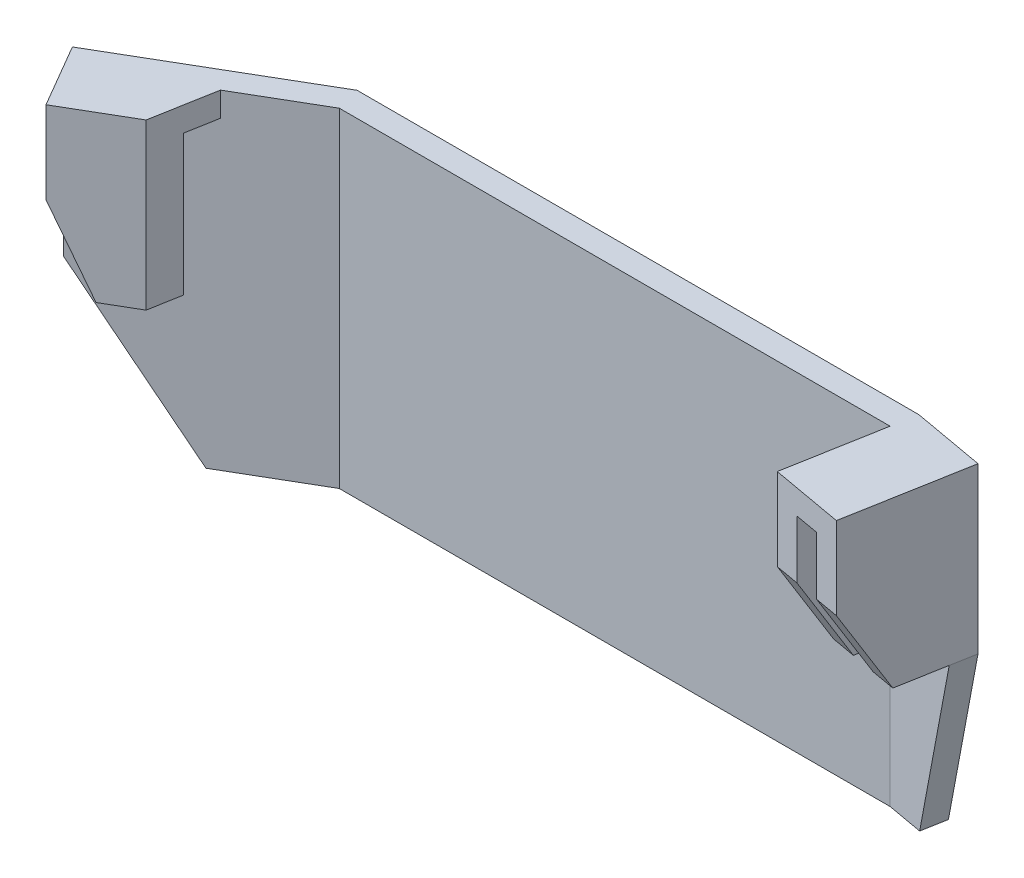
ISO-10303-21;
HEADER;
FILE_DESCRIPTION(('STEP AP214'),'2;1');
FILE_NAME('part.step','',(''),(''),'','','');
FILE_SCHEMA(('AUTOMOTIVE_DESIGN { 1 0 10303 214 1 1 1 1 }'));
ENDSEC;
DATA;
#1=APPLICATION_CONTEXT('core data for automotive mechanical design processes');
#2=APPLICATION_PROTOCOL_DEFINITION('international standard','automotive_design',2000,#1);
#3=PRODUCT_CONTEXT('',#1,'mechanical');
#4=PRODUCT('Part','Part','',(#3));
#5=PRODUCT_RELATED_PRODUCT_CATEGORY('part','',(#4));
#6=PRODUCT_DEFINITION_FORMATION('','',#4);
#7=PRODUCT_DEFINITION_CONTEXT('part definition',#1,'design');
#8=PRODUCT_DEFINITION('design','',#6,#7);
#9=PRODUCT_DEFINITION_SHAPE('','',#8);
#10=(LENGTH_UNIT() NAMED_UNIT(*) SI_UNIT(.MILLI.,.METRE.));
#11=(NAMED_UNIT(*) PLANE_ANGLE_UNIT() SI_UNIT($,.RADIAN.));
#12=(NAMED_UNIT(*) SI_UNIT($,.STERADIAN.) SOLID_ANGLE_UNIT());
#13=UNCERTAINTY_MEASURE_WITH_UNIT(LENGTH_MEASURE(1.E-05),#10,'distance_accuracy_value','');
#14=(GEOMETRIC_REPRESENTATION_CONTEXT(3) GLOBAL_UNCERTAINTY_ASSIGNED_CONTEXT((#13)) GLOBAL_UNIT_ASSIGNED_CONTEXT((#10,
#11,#12)) REPRESENTATION_CONTEXT('',''));
#15=CARTESIAN_POINT('',(0.,0.,0.));
#16=DIRECTION('',(0.,0.,1.));
#17=DIRECTION('',(1.,0.,0.));
#18=AXIS2_PLACEMENT_3D('',#15,#16,#17);
#19=CARTESIAN_POINT('',(0.,-2.,0.));
#20=DIRECTION('',(0.,-1.,0.));
#21=DIRECTION('',(0.,0.,1.));
#22=AXIS2_PLACEMENT_3D('',#19,#20,#21);
#23=PLANE('',#22);
#24=DIRECTION('',(-0.503445701101629,0.,-0.864026866504907));
#25=VECTOR('',#24,1.);
#26=CARTESIAN_POINT('',(-34.7487526832089,-2.,13.7751158130892));
#27=LINE('',#26,#25);
#28=CARTESIAN_POINT('',(-35.7556440854121,-2.,12.0470620800794));
#29=VERTEX_POINT('',#28);
#30=CARTESIAN_POINT('',(-36.7625354876154,-2.,10.3190083470696));
#31=VERTEX_POINT('',#30);
#32=EDGE_CURVE('E345',#29,#31,#27,.T.);
#33=ORIENTED_EDGE('',*,*,#32,.T.);
#34=DIRECTION('',(0.86402686650491,0.,-0.503445701101625));
#35=VECTOR('',#34,1.);
#36=CARTESIAN_POINT('',(-22.4852326944472,-2.,1.99999999999987));
#37=LINE('',#36,#35);
#38=CARTESIAN_POINT('',(-28.6377652807636,-2.,5.58491871207461));
#39=VERTEX_POINT('',#38);
#40=EDGE_CURVE('E309',#31,#39,#37,.T.);
#41=ORIENTED_EDGE('',*,*,#40,.T.);
#42=DIRECTION('',(-0.176472793536463,0.,0.984305518191093));
#43=VECTOR('',#42,1.);
#44=CARTESIAN_POINT('',(-29.5645914841794,-2.,10.7544416064795));
#45=LINE('',#44,#43);
#46=CARTESIAN_POINT('',(-29.1011783824715,-2.,8.16968015927698));
#47=VERTEX_POINT('',#46);
#48=EDGE_CURVE('E342',#39,#47,#45,.T.);
#49=ORIENTED_EDGE('',*,*,#48,.T.);
#50=DIRECTION('',(-0.864026866504906,0.,0.503445701101631));
#51=VECTOR('',#50,1.);
#52=CARTESIAN_POINT('',(-35.7556440854121,-2.,12.0470620800794));
#53=LINE('',#52,#51);
#54=EDGE_CURVE('E283',#47,#29,#53,.T.);
#55=ORIENTED_EDGE('',*,*,#54,.T.);
#56=EDGE_LOOP('',(#33,#41,#49,#55));
#57=FACE_BOUND('',#56,.T.);
#58=ADVANCED_FACE('F45',(#57),#23,.T.);
#59=DIRECTION('',(-0.984305518191093,0.,-0.176472793536465));
#60=VECTOR('',#59,1.);
#61=CARTESIAN_POINT('',(27.1665078734454,-2.,10.9018919431298));
#62=LINE('',#61,#60);
#63=CARTESIAN_POINT('',(25.1978968370632,-2.,10.5489463560569));
#64=VERTEX_POINT('',#63);
#65=CARTESIAN_POINT('',(23.229285800681,-2.,10.196000768984));
#66=VERTEX_POINT('',#65);
#67=EDGE_CURVE('E349',#64,#66,#62,.T.);
#68=ORIENTED_EDGE('',*,*,#67,.T.);
#69=DIRECTION('',(0.176472793536465,0.,-0.984305518191093));
#70=VECTOR('',#69,1.);
#71=CARTESIAN_POINT('',(23.229285800681,-2.,10.196000768984));
#72=LINE('',#71,#70);
#73=CARTESIAN_POINT('',(24.6354405286469,-2.,2.35294558506221));
#74=VERTEX_POINT('',#73);
#75=EDGE_CURVE('E331',#66,#74,#72,.T.);
#76=ORIENTED_EDGE('',*,*,#75,.T.);
#77=DIRECTION('',(0.984305518191093,0.,0.176472793536464));
#78=VECTOR('',#77,1.);
#79=CARTESIAN_POINT('',(28.5726626014112,-2.,3.05883675920806));
#80=LINE('',#79,#78);
#81=CARTESIAN_POINT('',(26.6040515650291,-2.,2.70589117213513));
#82=VERTEX_POINT('',#81);
#83=EDGE_CURVE('E314',#74,#82,#80,.T.);
#84=ORIENTED_EDGE('',*,*,#83,.T.);
#85=DIRECTION('',(-0.176472793536466,0.,0.984305518191093));
#86=VECTOR('',#85,1.);
#87=CARTESIAN_POINT('',(25.1978968370632,-2.,10.5489463560569));
#88=LINE('',#87,#86);
#89=EDGE_CURVE('E286',#82,#64,#88,.T.);
#90=ORIENTED_EDGE('',*,*,#89,.T.);
#91=EDGE_LOOP('',(#68,#76,#84,#90));
#92=FACE_BOUND('',#91,.T.);
#93=ADVANCED_FACE('F435',(#92),#23,.T.);
#94=CARTESIAN_POINT('',(28.5726626014112,-27.,3.05883675920806));
#95=DIRECTION('',(0.176472793536464,0.,-0.984305518191093));
#96=DIRECTION('',(0.984305518191093,0.,0.176472793536464));
#97=AXIS2_PLACEMENT_3D('',#94,#95,#96);
#98=PLANE('',#97);
#99=DIRECTION('',(-0.984305518191094,0.,-0.17647279353646));
#100=VECTOR('',#99,1.);
#101=CARTESIAN_POINT('',(26.6040515650291,-13.5,2.70589117213513));
#102=LINE('',#101,#100);
#103=CARTESIAN_POINT('',(28.5726626014113,-13.5,3.05883675920806));
#104=VERTEX_POINT('',#103);
#105=CARTESIAN_POINT('',(26.6040515650291,-13.5,2.70589117213513));
#106=VERTEX_POINT('',#105);
#107=EDGE_CURVE('E297',#104,#106,#102,.T.);
#108=ORIENTED_EDGE('',*,*,#107,.T.);
#109=DIRECTION('',(0.,1.,0.));
#110=VECTOR('',#109,1.);
#111=CARTESIAN_POINT('',(26.6040515650291,-13.5,2.70589117213513));
#112=LINE('',#111,#110);
#113=EDGE_CURVE('E307',#106,#82,#112,.T.);
#114=ORIENTED_EDGE('',*,*,#113,.T.);
#115=ORIENTED_EDGE('',*,*,#83,.F.);
#116=DIRECTION('',(0.,1.,0.));
#117=VECTOR('',#116,1.);
#118=CARTESIAN_POINT('',(24.6354405286469,-27.,2.35294558506221));
#119=LINE('',#118,#117);
#120=CARTESIAN_POINT('',(24.6354405286469,-13.5,2.3529455850622));
#121=VERTEX_POINT('',#120);
#122=EDGE_CURVE('E328',#121,#74,#119,.T.);
#123=ORIENTED_EDGE('',*,*,#122,.F.);
#124=DIRECTION('',(0.984305518191093,0.,0.176472793536465));
#125=VECTOR('',#124,1.);
#126=CARTESIAN_POINT('',(7.23673658171905,-13.5,-0.766408957489687));
#127=LINE('',#126,#125);
#128=CARTESIAN_POINT('',(22.6668294922647,-13.5,1.99999999798927));
#129=VERTEX_POINT('',#128);
#130=EDGE_CURVE('E255',#129,#121,#127,.T.);
#131=ORIENTED_EDGE('',*,*,#130,.F.);
#132=DIRECTION('',(0.,1.,0.));
#133=VECTOR('',#132,1.);
#134=CARTESIAN_POINT('',(22.6668294919042,-2.,1.99999999999999));
#135=LINE('',#134,#133);
#136=CARTESIAN_POINT('',(22.6668294922647,-27.,1.99999999798927));
#137=VERTEX_POINT('',#136);
#138=EDGE_CURVE('E54',#137,#129,#135,.T.);
#139=ORIENTED_EDGE('',*,*,#138,.F.);
#140=DIRECTION('',(0.984305518191093,0.,0.176472793536464));
#141=VECTOR('',#140,1.);
#142=CARTESIAN_POINT('',(28.5726626014112,-27.,3.05883675920806));
#143=LINE('',#142,#141);
#144=CARTESIAN_POINT('',(25.619746046838,-27.,2.52941837859867));
#145=VERTEX_POINT('',#144);
#146=EDGE_CURVE('E316',#137,#145,#143,.T.);
#147=ORIENTED_EDGE('',*,*,#146,.T.);
#148=DIRECTION('',(0.213525846694621,0.976187060183953,0.0382823238944019));
#149=VECTOR('',#148,1.);
#150=CARTESIAN_POINT('',(28.5726626014113,-13.5,3.05883675920806));
#151=LINE('',#150,#149);
#152=EDGE_CURVE('E264',#145,#104,#151,.T.);
#153=ORIENTED_EDGE('',*,*,#152,.T.);
#154=EDGE_LOOP('',(#108,#114,#115,#123,#131,#139,#147,#153));
#155=FACE_BOUND('',#154,.T.);
#156=ADVANCED_FACE('F440',(#155),#98,.F.);
#157=CARTESIAN_POINT('',(-28.6377652807636,-2.,5.58491871207461));
#158=DIRECTION('',(0.503445701101629,0.,0.864026866504908));
#159=DIRECTION('',(-0.864026866504908,0.,0.503445701101629));
#160=AXIS2_PLACEMENT_3D('',#157,#158,#159);
#161=PLANE('',#160);
#162=DIRECTION('',(-0.461610143904346,0.845323754537753,0.268968074422981));
#163=VECTOR('',#162,1.);
#164=CARTESIAN_POINT('',(-29.3905233925378,-27.,6.02353104003973));
#165=LINE('',#164,#163);
#166=CARTESIAN_POINT('',(-29.3905233925379,-27.,6.02353104003963));
#167=VERTEX_POINT('',#166);
#168=CARTESIAN_POINT('',(-36.7625354876154,-13.5,10.3190083470697));
#169=VERTEX_POINT('',#168);
#170=EDGE_CURVE('E272',#167,#169,#165,.T.);
#171=ORIENTED_EDGE('',*,*,#170,.F.);
#172=DIRECTION('',(0.864026866504906,0.,-0.503445701101632));
#173=VECTOR('',#172,1.);
#174=CARTESIAN_POINT('',(-28.6377652807636,-27.,5.58491871207448));
#175=LINE('',#174,#173);
#176=CARTESIAN_POINT('',(-22.4852326944472,-27.,1.99999999999987));
#177=VERTEX_POINT('',#176);
#178=EDGE_CURVE('E310',#167,#177,#175,.T.);
#179=ORIENTED_EDGE('',*,*,#178,.T.);
#180=DIRECTION('',(0.,1.,0.));
#181=VECTOR('',#180,1.);
#182=CARTESIAN_POINT('',(-22.4852326944472,-2.,1.99999999999997));
#183=LINE('',#182,#181);
#184=CARTESIAN_POINT('',(-22.4852326944472,0.,1.99999999999997));
#185=VERTEX_POINT('',#184);
#186=EDGE_CURVE('E11',#177,#185,#183,.T.);
#187=ORIENTED_EDGE('',*,*,#186,.T.);
#188=DIRECTION('',(-0.864026866504908,0.,0.503445701101629));
#189=VECTOR('',#188,1.);
#190=CARTESIAN_POINT('',(-28.6377652807636,0.,5.58491871207461));
#191=LINE('',#190,#189);
#192=CARTESIAN_POINT('',(-28.6377652807636,0.,5.58491871207461));
#193=VERTEX_POINT('',#192);
#194=EDGE_CURVE('E341',#185,#193,#191,.T.);
#195=ORIENTED_EDGE('',*,*,#194,.T.);
#196=DIRECTION('',(0.,1.,0.));
#197=VECTOR('',#196,1.);
#198=CARTESIAN_POINT('',(-28.6377652807636,-2.,5.58491871207461));
#199=LINE('',#198,#197);
#200=EDGE_CURVE('E49',#39,#193,#199,.T.);
#201=ORIENTED_EDGE('',*,*,#200,.F.);
#202=ORIENTED_EDGE('',*,*,#40,.F.);
#203=DIRECTION('',(0.,1.,0.));
#204=VECTOR('',#203,1.);
#205=CARTESIAN_POINT('',(-36.7625354876154,-27.,10.3190083470696));
#206=LINE('',#205,#204);
#207=EDGE_CURVE('E339',#169,#31,#206,.T.);
#208=ORIENTED_EDGE('',*,*,#207,.F.);
#209=EDGE_LOOP('',(#171,#179,#187,#195,#201,#202,#208));
#210=FACE_BOUND('',#209,.T.);
#211=ADVANCED_FACE('F47',(#210),#161,.T.);
#212=CARTESIAN_POINT('',(-22.4852326944472,-2.,1.99999999999997));
#213=DIRECTION('',(0.,0.,1.));
#214=DIRECTION('',(-1.,0.,0.));
#215=AXIS2_PLACEMENT_3D('',#212,#213,#214);
#216=PLANE('',#215);
#217=DIRECTION('',(-1.,0.,0.));
#218=VECTOR('',#217,1.);
#219=CARTESIAN_POINT('',(-22.4852326944472,0.,1.99999999999997));
#220=LINE('',#219,#218);
#221=CARTESIAN_POINT('',(22.6668294919042,0.,1.99999999999999));
#222=VERTEX_POINT('',#221);
#223=EDGE_CURVE('E346',#222,#185,#220,.T.);
#224=ORIENTED_EDGE('',*,*,#223,.T.);
#225=ORIENTED_EDGE('',*,*,#186,.F.);
#226=DIRECTION('',(1.,0.,0.));
#227=VECTOR('',#226,1.);
#228=CARTESIAN_POINT('',(-22.4852326944472,-27.,1.99999999999987));
#229=LINE('',#228,#227);
#230=EDGE_CURVE('E313',#177,#137,#229,.T.);
#231=ORIENTED_EDGE('',*,*,#230,.T.);
#232=ORIENTED_EDGE('',*,*,#138,.T.);
#233=EDGE_CURVE('E374',#129,#222,#135,.T.);
#234=ORIENTED_EDGE('',*,*,#233,.T.);
#235=EDGE_LOOP('',(#224,#225,#231,#232,#234));
#236=FACE_BOUND('',#235,.T.);
#237=ADVANCED_FACE('F448',(#236),#216,.T.);
#238=CARTESIAN_POINT('',(22.6668294919042,-2.,1.99999999999999));
#239=DIRECTION('',(-0.984305518191093,0.,-0.176472793536464));
#240=DIRECTION('',(0.176472793536464,0.,-0.984305518191093));
#241=AXIS2_PLACEMENT_3D('',#238,#239,#240);
#242=PLANE('',#241);
#243=DIRECTION('',(0.0897004228160788,-0.86118240328275,-0.50031860091622));
#244=VECTOR('',#243,1.);
#245=CARTESIAN_POINT('',(21.9637521282818,-13.5,5.92152758995016));
#246=LINE('',#245,#244);
#247=CARTESIAN_POINT('',(21.2606747642988,-6.75,9.84305518191105));
#248=VERTEX_POINT('',#247);
#249=CARTESIAN_POINT('',(21.9637521282818,-13.5,5.92152758995016));
#250=VERTEX_POINT('',#249);
#251=EDGE_CURVE('E239',#248,#250,#246,.T.);
#252=ORIENTED_EDGE('',*,*,#251,.F.);
#253=DIRECTION('',(0.,1.,0.));
#254=VECTOR('',#253,1.);
#255=CARTESIAN_POINT('',(21.2606747642988,-2.,9.84305518191103));
#256=LINE('',#255,#254);
#257=CARTESIAN_POINT('',(21.2606747642988,0.,9.84305518191103));
#258=VERTEX_POINT('',#257);
#259=EDGE_CURVE('E375',#248,#258,#256,.T.);
#260=ORIENTED_EDGE('',*,*,#259,.T.);
#261=DIRECTION('',(0.176472793536464,0.,-0.984305518191093));
#262=VECTOR('',#261,1.);
#263=CARTESIAN_POINT('',(22.6668294919042,0.,1.99999999999999));
#264=LINE('',#263,#262);
#265=EDGE_CURVE('E369',#258,#222,#264,.T.);
#266=ORIENTED_EDGE('',*,*,#265,.T.);
#267=ORIENTED_EDGE('',*,*,#233,.F.);
#268=DIRECTION('',(0.176472793536464,0.,-0.984305518191093));
#269=VECTOR('',#268,1.);
#270=CARTESIAN_POINT('',(22.6668294922647,-13.5,1.99999999798925));
#271=LINE('',#270,#269);
#272=EDGE_CURVE('E253',#250,#129,#271,.T.);
#273=ORIENTED_EDGE('',*,*,#272,.F.);
#274=EDGE_LOOP('',(#252,#260,#266,#267,#273));
#275=FACE_BOUND('',#274,.T.);
#276=ADVANCED_FACE('F451',(#275),#242,.T.);
#277=CARTESIAN_POINT('',(27.1665078734454,-2.,10.9018919431298));
#278=DIRECTION('',(-0.176472793536466,0.,0.984305518191093));
#279=DIRECTION('',(-0.984305518191093,0.,-0.176472793536466));
#280=AXIS2_PLACEMENT_3D('',#277,#278,#279);
#281=PLANE('',#280);
#282=DIRECTION('',(0.984305518191093,0.,0.176472793536463));
#283=VECTOR('',#282,1.);
#284=CARTESIAN_POINT('',(13.545628309026,-6.75,8.45985070417158));
#285=LINE('',#284,#283);
#286=CARTESIAN_POINT('',(23.229285800681,-6.75,10.196000768984));
#287=VERTEX_POINT('',#286);
#288=EDGE_CURVE('E242',#248,#287,#285,.T.);
#289=ORIENTED_EDGE('',*,*,#288,.T.);
#290=DIRECTION('',(0.,1.,0.));
#291=VECTOR('',#290,1.);
#292=CARTESIAN_POINT('',(23.229285800681,-27.,10.196000768984));
#293=LINE('',#292,#291);
#294=EDGE_CURVE('E337',#287,#66,#293,.T.);
#295=ORIENTED_EDGE('',*,*,#294,.T.);
#296=ORIENTED_EDGE('',*,*,#67,.F.);
#297=DIRECTION('',(0.,1.,0.));
#298=VECTOR('',#297,1.);
#299=CARTESIAN_POINT('',(25.1978968370632,-13.5,10.5489463560569));
#300=LINE('',#299,#298);
#301=CARTESIAN_POINT('',(25.1978968370632,-6.75,10.5489463560569));
#302=VERTEX_POINT('',#301);
#303=EDGE_CURVE('E303',#302,#64,#300,.T.);
#304=ORIENTED_EDGE('',*,*,#303,.F.);
#305=CARTESIAN_POINT('',(27.1665078734454,-6.75,10.9018919431298));
#306=VERTEX_POINT('',#305);
#307=EDGE_CURVE('E238',#302,#306,#285,.T.);
#308=ORIENTED_EDGE('',*,*,#307,.T.);
#309=DIRECTION('',(0.,1.,0.));
#310=VECTOR('',#309,1.);
#311=CARTESIAN_POINT('',(27.1665078734454,-2.,10.9018919431298));
#312=LINE('',#311,#310);
#313=CARTESIAN_POINT('',(27.1665078734454,0.,10.9018919431298));
#314=VERTEX_POINT('',#313);
#315=EDGE_CURVE('E378',#306,#314,#312,.T.);
#316=ORIENTED_EDGE('',*,*,#315,.T.);
#317=DIRECTION('',(-0.984305518191093,0.,-0.176472793536465));
#318=VECTOR('',#317,1.);
#319=CARTESIAN_POINT('',(27.1665078734454,0.,10.9018919431298));
#320=LINE('',#319,#318);
#321=EDGE_CURVE('E367',#314,#258,#320,.T.);
#322=ORIENTED_EDGE('',*,*,#321,.T.);
#323=ORIENTED_EDGE('',*,*,#259,.F.);
#324=EDGE_LOOP('',(#289,#295,#296,#304,#308,#316,#322,#323));
#325=FACE_BOUND('',#324,.T.);
#326=ADVANCED_FACE('F455',(#325),#281,.T.);
#327=CARTESIAN_POINT('',(28.93123580881,-2.,1.05883676121879));
#328=DIRECTION('',(0.984305518191094,0.,0.176472793536463));
#329=DIRECTION('',(-0.176472793536463,0.,0.984305518191093));
#330=AXIS2_PLACEMENT_3D('',#327,#328,#329);
#331=PLANE('',#330);
#332=DIRECTION('',(0.0897004228160782,-0.86118240328275,-0.50031860091622));
#333=VECTOR('',#332,1.);
#334=CARTESIAN_POINT('',(27.8695852374283,-13.5,6.98036435116894));
#335=LINE('',#334,#333);
#336=CARTESIAN_POINT('',(27.8695852374283,-13.5,6.98036435116894));
#337=VERTEX_POINT('',#336);
#338=EDGE_CURVE('E235',#306,#337,#335,.T.);
#339=ORIENTED_EDGE('',*,*,#338,.T.);
#340=DIRECTION('',(0.17647279353646,0.,-0.984305518191094));
#341=VECTOR('',#340,1.);
#342=CARTESIAN_POINT('',(28.5726626014112,-13.5,3.05883675920805));
#343=LINE('',#342,#341);
#344=EDGE_CURVE('E294',#337,#104,#343,.T.);
#345=ORIENTED_EDGE('',*,*,#344,.T.);
#346=DIRECTION('',(0.176472793536464,0.,-0.984305518191093));
#347=VECTOR('',#346,1.);
#348=CARTESIAN_POINT('',(26.1321644531431,-13.5,16.6711094859903));
#349=LINE('',#348,#347);
#350=CARTESIAN_POINT('',(28.93123580881,-13.5,1.05883676121879));
#351=VERTEX_POINT('',#350);
#352=EDGE_CURVE('E261',#104,#351,#349,.T.);
#353=ORIENTED_EDGE('',*,*,#352,.T.);
#354=DIRECTION('',(0.,1.,0.));
#355=VECTOR('',#354,1.);
#356=CARTESIAN_POINT('',(28.93123580881,-2.,1.05883676121879));
#357=LINE('',#356,#355);
#358=CARTESIAN_POINT('',(28.93123580881,0.,1.05883676121879));
#359=VERTEX_POINT('',#358);
#360=EDGE_CURVE('E381',#351,#359,#357,.T.);
#361=ORIENTED_EDGE('',*,*,#360,.T.);
#362=DIRECTION('',(-0.176472793536463,0.,0.984305518191093));
#363=VECTOR('',#362,1.);
#364=CARTESIAN_POINT('',(28.93123580881,0.,1.05883676121879));
#365=LINE('',#364,#363);
#366=EDGE_CURVE('E365',#359,#314,#365,.T.);
#367=ORIENTED_EDGE('',*,*,#366,.T.);
#368=ORIENTED_EDGE('',*,*,#315,.F.);
#369=EDGE_LOOP('',(#339,#345,#353,#361,#367,#368));
#370=FACE_BOUND('',#369,.T.);
#371=ADVANCED_FACE('F459',(#370),#331,.T.);
#372=CARTESIAN_POINT('',(23.0254026996635,-2.,0.));
#373=DIRECTION('',(0.176472793536464,0.,-0.984305518191093));
#374=DIRECTION('',(0.984305518191093,0.,0.176472793536464));
#375=AXIS2_PLACEMENT_3D('',#372,#373,#374);
#376=PLANE('',#375);
#377=DIRECTION('',(-0.213525846694621,-0.976187060183953,-0.0382823238944019));
#378=VECTOR('',#377,1.);
#379=CARTESIAN_POINT('',(28.93123580881,-13.5,1.05883676121879));
#380=LINE('',#379,#378);
#381=CARTESIAN_POINT('',(25.9783192542368,-27.,0.529418380609407));
#382=VERTEX_POINT('',#381);
#383=EDGE_CURVE('E258',#351,#382,#380,.T.);
#384=ORIENTED_EDGE('',*,*,#383,.T.);
#385=DIRECTION('',(-0.984305518191093,0.,-0.176472793536464));
#386=VECTOR('',#385,1.);
#387=CARTESIAN_POINT('',(23.0254026996635,-27.,0.));
#388=LINE('',#387,#386);
#389=CARTESIAN_POINT('',(23.0254026996635,-27.,0.));
#390=VERTEX_POINT('',#389);
#391=EDGE_CURVE('E319',#382,#390,#388,.T.);
#392=ORIENTED_EDGE('',*,*,#391,.T.);
#393=DIRECTION('',(0.,1.,0.));
#394=VECTOR('',#393,1.);
#395=CARTESIAN_POINT('',(23.0254026996635,-2.,0.));
#396=LINE('',#395,#394);
#397=CARTESIAN_POINT('',(23.0254026996635,0.,0.));
#398=VERTEX_POINT('',#397);
#399=EDGE_CURVE('E384',#390,#398,#396,.T.);
#400=ORIENTED_EDGE('',*,*,#399,.T.);
#401=DIRECTION('',(0.984305518191093,0.,0.176472793536464));
#402=VECTOR('',#401,1.);
#403=CARTESIAN_POINT('',(23.0254026996635,0.,0.));
#404=LINE('',#403,#402);
#405=EDGE_CURVE('E363',#398,#359,#404,.T.);
#406=ORIENTED_EDGE('',*,*,#405,.T.);
#407=ORIENTED_EDGE('',*,*,#360,.F.);
#408=EDGE_LOOP('',(#384,#392,#400,#406,#407));
#409=FACE_BOUND('',#408,.T.);
#410=ADVANCED_FACE('F463',(#409),#376,.T.);
#411=CARTESIAN_POINT('',(23.0254026996635,-2.,0.));
#412=DIRECTION('',(0.,0.,-1.));
#413=DIRECTION('',(1.,0.,0.));
#414=AXIS2_PLACEMENT_3D('',#411,#412,#413);
#415=PLANE('',#414);
#416=DIRECTION('',(1.,0.,0.));
#417=VECTOR('',#416,1.);
#418=CARTESIAN_POINT('',(23.0254026996635,0.,0.));
#419=LINE('',#418,#417);
#420=CARTESIAN_POINT('',(-23.0254026996635,0.,0.));
#421=VERTEX_POINT('',#420);
#422=EDGE_CURVE('E361',#421,#398,#419,.T.);
#423=ORIENTED_EDGE('',*,*,#422,.T.);
#424=ORIENTED_EDGE('',*,*,#399,.F.);
#425=DIRECTION('',(-1.,0.,0.));
#426=VECTOR('',#425,1.);
#427=CARTESIAN_POINT('',(-23.0254026996635,-27.,0.));
#428=LINE('',#427,#426);
#429=CARTESIAN_POINT('',(-23.0254026996635,-27.,0.));
#430=VERTEX_POINT('',#429);
#431=EDGE_CURVE('E322',#390,#430,#428,.T.);
#432=ORIENTED_EDGE('',*,*,#431,.T.);
#433=DIRECTION('',(0.,1.,0.));
#434=VECTOR('',#433,1.);
#435=CARTESIAN_POINT('',(-23.0254026996635,-2.,0.));
#436=LINE('',#435,#434);
#437=EDGE_CURVE('E387',#430,#421,#436,.T.);
#438=ORIENTED_EDGE('',*,*,#437,.T.);
#439=EDGE_LOOP('',(#423,#424,#432,#438));
#440=FACE_BOUND('',#439,.T.);
#441=ADVANCED_FACE('F467',(#440),#415,.T.);
#442=CARTESIAN_POINT('',(-37.7694268898186,-2.,8.59095461405983));
#443=DIRECTION('',(-0.503445701101629,0.,-0.864026866504908));
#444=DIRECTION('',(0.864026866504908,0.,-0.503445701101629));
#445=AXIS2_PLACEMENT_3D('',#442,#443,#444);
#446=PLANE('',#445);
#447=DIRECTION('',(-0.461610143904346,0.845323754537753,0.268968074422981));
#448=VECTOR('',#447,1.);
#449=CARTESIAN_POINT('',(-30.3974147947411,-27.,4.29547730702991));
#450=LINE('',#449,#448);
#451=CARTESIAN_POINT('',(-30.3974147947411,-27.,4.29547730702991));
#452=VERTEX_POINT('',#451);
#453=CARTESIAN_POINT('',(-37.7694268898186,-13.5,8.59095461405983));
#454=VERTEX_POINT('',#453);
#455=EDGE_CURVE('E269',#452,#454,#450,.T.);
#456=ORIENTED_EDGE('',*,*,#455,.T.);
#457=DIRECTION('',(0.,1.,0.));
#458=VECTOR('',#457,1.);
#459=CARTESIAN_POINT('',(-37.7694268898186,-2.,8.59095461405983));
#460=LINE('',#459,#458);
#461=CARTESIAN_POINT('',(-37.7694268898186,0.,8.59095461405983));
#462=VERTEX_POINT('',#461);
#463=EDGE_CURVE('E223',#454,#462,#460,.T.);
#464=ORIENTED_EDGE('',*,*,#463,.T.);
#465=DIRECTION('',(0.864026866504908,0.,-0.503445701101629));
#466=VECTOR('',#465,1.);
#467=CARTESIAN_POINT('',(-37.7694268898186,0.,8.59095461405983));
#468=LINE('',#467,#466);
#469=EDGE_CURVE('E359',#462,#421,#468,.T.);
#470=ORIENTED_EDGE('',*,*,#469,.T.);
#471=ORIENTED_EDGE('',*,*,#437,.F.);
#472=DIRECTION('',(-0.864026866504908,0.,0.503445701101629));
#473=VECTOR('',#472,1.);
#474=CARTESIAN_POINT('',(-37.7694268898186,-27.,8.59095461405983));
#475=LINE('',#474,#473);
#476=EDGE_CURVE('E325',#430,#452,#475,.T.);
#477=ORIENTED_EDGE('',*,*,#476,.T.);
#478=EDGE_LOOP('',(#456,#464,#470,#471,#477));
#479=FACE_BOUND('',#478,.T.);
#480=ADVANCED_FACE('F411',(#479),#446,.T.);
#481=CARTESIAN_POINT('',(-34.7487526832089,-2.,13.7751158130892));
#482=DIRECTION('',(-0.864026866504907,0.,0.503445701101629));
#483=DIRECTION('',(-0.503445701101629,0.,-0.864026866504907));
#484=AXIS2_PLACEMENT_3D('',#481,#482,#483);
#485=PLANE('',#484);
#486=DIRECTION('',(0.503445701101628,0.,0.864026866504908));
#487=VECTOR('',#486,1.);
#488=CARTESIAN_POINT('',(-39.4744179262187,-6.75,5.66480377122568));
#489=LINE('',#488,#487);
#490=CARTESIAN_POINT('',(-35.7556440854121,-6.75,12.0470620800794));
#491=VERTEX_POINT('',#490);
#492=CARTESIAN_POINT('',(-34.7487526832089,-6.75,13.7751158130892));
#493=VERTEX_POINT('',#492);
#494=EDGE_CURVE('E211',#491,#493,#489,.T.);
#495=ORIENTED_EDGE('',*,*,#494,.T.);
#496=DIRECTION('',(0.,1.,0.));
#497=VECTOR('',#496,1.);
#498=CARTESIAN_POINT('',(-34.7487526832089,-2.,13.7751158130892));
#499=LINE('',#498,#497);
#500=CARTESIAN_POINT('',(-34.7487526832089,0.,13.7751158130892));
#501=VERTEX_POINT('',#500);
#502=EDGE_CURVE('E216',#493,#501,#499,.T.);
#503=ORIENTED_EDGE('',*,*,#502,.T.);
#504=DIRECTION('',(-0.503445701101629,0.,-0.864026866504907));
#505=VECTOR('',#504,1.);
#506=CARTESIAN_POINT('',(-34.7487526832089,0.,13.7751158130892));
#507=LINE('',#506,#505);
#508=EDGE_CURVE('E357',#501,#462,#507,.T.);
#509=ORIENTED_EDGE('',*,*,#508,.T.);
#510=ORIENTED_EDGE('',*,*,#463,.F.);
#511=DIRECTION('',(-0.503445701101629,0.,-0.864026866504908));
#512=VECTOR('',#511,1.);
#513=CARTESIAN_POINT('',(-28.722400653609,-13.5,24.1177010197897));
#514=LINE('',#513,#512);
#515=EDGE_CURVE('E275',#169,#454,#514,.T.);
#516=ORIENTED_EDGE('',*,*,#515,.F.);
#517=ORIENTED_EDGE('',*,*,#207,.T.);
#518=ORIENTED_EDGE('',*,*,#32,.F.);
#519=DIRECTION('',(0.,1.,0.));
#520=VECTOR('',#519,1.);
#521=CARTESIAN_POINT('',(-35.7556440854121,-13.5,12.0470620800794));
#522=LINE('',#521,#520);
#523=EDGE_CURVE('E229',#491,#29,#522,.T.);
#524=ORIENTED_EDGE('',*,*,#523,.F.);
#525=EDGE_LOOP('',(#495,#503,#509,#510,#516,#517,#518,#524));
#526=FACE_BOUND('',#525,.T.);
#527=ADVANCED_FACE('F227',(#526),#485,.T.);
#528=CARTESIAN_POINT('',(-29.5645914841794,-2.,10.7544416064795));
#529=DIRECTION('',(0.503445701101628,0.,0.864026866504908));
#530=DIRECTION('',(-0.864026866504908,0.,0.503445701101628));
#531=AXIS2_PLACEMENT_3D('',#528,#529,#530);
#532=PLANE('',#531);
#533=DIRECTION('',(0.350914546191269,-0.913811548620258,-0.204468664786617));
#534=VECTOR('',#533,1.);
#535=CARTESIAN_POINT('',(-34.7487526832089,-6.75,13.7751158130892));
#536=LINE('',#535,#534);
#537=CARTESIAN_POINT('',(-32.1566720836942,-13.5,12.2647787097844));
#538=VERTEX_POINT('',#537);
#539=EDGE_CURVE('E207',#493,#538,#536,.T.);
#540=ORIENTED_EDGE('',*,*,#539,.T.);
#541=DIRECTION('',(0.864026866504908,0.,-0.503445701101628));
#542=VECTOR('',#541,1.);
#543=CARTESIAN_POINT('',(-29.5645914841794,-13.5,10.7544416064795));
#544=LINE('',#543,#542);
#545=CARTESIAN_POINT('',(-29.5645914841794,-13.5,10.7544416064795));
#546=VERTEX_POINT('',#545);
#547=EDGE_CURVE('E287',#538,#546,#544,.T.);
#548=ORIENTED_EDGE('',*,*,#547,.T.);
#549=DIRECTION('',(0.,1.,0.));
#550=VECTOR('',#549,1.);
#551=CARTESIAN_POINT('',(-29.5645914841794,-2.,10.7544416064795));
#552=LINE('',#551,#550);
#553=CARTESIAN_POINT('',(-29.5645914841794,0.,10.7544416064795));
#554=VERTEX_POINT('',#553);
#555=EDGE_CURVE('E224',#546,#554,#552,.T.);
#556=ORIENTED_EDGE('',*,*,#555,.T.);
#557=DIRECTION('',(-0.864026866504908,0.,0.503445701101628));
#558=VECTOR('',#557,1.);
#559=CARTESIAN_POINT('',(-29.5645914841794,0.,10.7544416064795));
#560=LINE('',#559,#558);
#561=EDGE_CURVE('E220',#554,#501,#560,.T.);
#562=ORIENTED_EDGE('',*,*,#561,.T.);
#563=ORIENTED_EDGE('',*,*,#502,.F.);
#564=EDGE_LOOP('',(#540,#548,#556,#562,#563));
#565=FACE_BOUND('',#564,.T.);
#566=ADVANCED_FACE('F217',(#565),#532,.T.);
#567=CARTESIAN_POINT('',(-29.5645914841794,-2.,10.7544416064795));
#568=DIRECTION('',(0.984305518191094,0.,0.176472793536463));
#569=DIRECTION('',(-0.176472793536463,0.,0.984305518191093));
#570=AXIS2_PLACEMENT_3D('',#567,#568,#569);
#571=PLANE('',#570);
#572=DIRECTION('',(-0.176472793536463,0.,0.984305518191093));
#573=VECTOR('',#572,1.);
#574=CARTESIAN_POINT('',(-29.5645914841794,0.,10.7544416064795));
#575=LINE('',#574,#573);
#576=EDGE_CURVE('E354',#193,#554,#575,.T.);
#577=ORIENTED_EDGE('',*,*,#576,.T.);
#578=ORIENTED_EDGE('',*,*,#555,.F.);
#579=DIRECTION('',(0.176472793536453,0.,-0.984305518191095));
#580=VECTOR('',#579,1.);
#581=CARTESIAN_POINT('',(-29.1011783824715,-13.5,8.16968015927698));
#582=LINE('',#581,#580);
#583=CARTESIAN_POINT('',(-29.1011783824715,-13.5,8.16968015927698));
#584=VERTEX_POINT('',#583);
#585=EDGE_CURVE('E290',#546,#584,#582,.T.);
#586=ORIENTED_EDGE('',*,*,#585,.T.);
#587=DIRECTION('',(0.,1.,0.));
#588=VECTOR('',#587,1.);
#589=CARTESIAN_POINT('',(-29.1011783824715,-13.5,8.16968015927698));
#590=LINE('',#589,#588);
#591=EDGE_CURVE('E279',#584,#47,#590,.T.);
#592=ORIENTED_EDGE('',*,*,#591,.T.);
#593=ORIENTED_EDGE('',*,*,#48,.F.);
#594=ORIENTED_EDGE('',*,*,#200,.T.);
#595=EDGE_LOOP('',(#577,#578,#586,#592,#593,#594));
#596=FACE_BOUND('',#595,.T.);
#597=ADVANCED_FACE('F395',(#596),#571,.T.);
#598=CARTESIAN_POINT('',(0.,0.,0.));
#599=DIRECTION('',(0.,-1.,0.));
#600=DIRECTION('',(0.,0.,1.));
#601=AXIS2_PLACEMENT_3D('',#598,#599,#600);
#602=PLANE('',#601);
#603=ORIENTED_EDGE('',*,*,#194,.F.);
#604=ORIENTED_EDGE('',*,*,#223,.F.);
#605=ORIENTED_EDGE('',*,*,#265,.F.);
#606=ORIENTED_EDGE('',*,*,#321,.F.);
#607=ORIENTED_EDGE('',*,*,#366,.F.);
#608=ORIENTED_EDGE('',*,*,#405,.F.);
#609=ORIENTED_EDGE('',*,*,#422,.F.);
#610=ORIENTED_EDGE('',*,*,#469,.F.);
#611=ORIENTED_EDGE('',*,*,#508,.F.);
#612=ORIENTED_EDGE('',*,*,#561,.F.);
#613=ORIENTED_EDGE('',*,*,#576,.F.);
#614=EDGE_LOOP('',(#603,#604,#605,#606,#607,#608,#609,#610,#611,#612,#613));
#615=FACE_BOUND('',#614,.T.);
#616=ADVANCED_FACE('F403',(#615),#602,.F.);
#617=CARTESIAN_POINT('',(23.229285800681,-27.,10.196000768984));
#618=DIRECTION('',(-0.984305518191093,0.,-0.176472793536465));
#619=DIRECTION('',(0.176472793536465,0.,-0.984305518191093));
#620=AXIS2_PLACEMENT_3D('',#617,#618,#619);
#621=PLANE('',#620);
#622=DIRECTION('',(0.176472793536465,0.,-0.984305518191093));
#623=VECTOR('',#622,1.);
#624=CARTESIAN_POINT('',(24.6354405286469,-13.5,2.3529455850622));
#625=LINE('',#624,#623);
#626=CARTESIAN_POINT('',(23.932363164664,-13.5,6.27447317702309));
#627=VERTEX_POINT('',#626);
#628=EDGE_CURVE('E251',#627,#121,#625,.T.);
#629=ORIENTED_EDGE('',*,*,#628,.T.);
#630=ORIENTED_EDGE('',*,*,#122,.T.);
#631=ORIENTED_EDGE('',*,*,#75,.F.);
#632=ORIENTED_EDGE('',*,*,#294,.F.);
#633=DIRECTION('',(-0.0897004228160794,0.86118240328275,0.50031860091622));
#634=VECTOR('',#633,1.);
#635=CARTESIAN_POINT('',(24.7935664210297,-21.768111417408,1.47097287231608));
#636=LINE('',#635,#634);
#637=EDGE_CURVE('E249',#627,#287,#636,.T.);
#638=ORIENTED_EDGE('',*,*,#637,.F.);
#639=EDGE_LOOP('',(#629,#630,#631,#632,#638));
#640=FACE_BOUND('',#639,.T.);
#641=ADVANCED_FACE('F444',(#640),#621,.F.);
#642=CARTESIAN_POINT('',(0.,-27.,0.));
#643=DIRECTION('',(0.,1.,0.));
#644=DIRECTION('',(0.,0.,-1.));
#645=AXIS2_PLACEMENT_3D('',#642,#643,#644);
#646=PLANE('',#645);
#647=ORIENTED_EDGE('',*,*,#230,.F.);
#648=ORIENTED_EDGE('',*,*,#178,.F.);
#649=DIRECTION('',(-0.503445701101629,0.,-0.864026866504908));
#650=VECTOR('',#649,1.);
#651=CARTESIAN_POINT('',(-21.3503885585315,-27.,19.8222237127597));
#652=LINE('',#651,#650);
#653=EDGE_CURVE('E277',#167,#452,#652,.T.);
#654=ORIENTED_EDGE('',*,*,#653,.T.);
#655=ORIENTED_EDGE('',*,*,#476,.F.);
#656=ORIENTED_EDGE('',*,*,#431,.F.);
#657=ORIENTED_EDGE('',*,*,#391,.F.);
#658=DIRECTION('',(0.176472793536464,0.,-0.984305518191093));
#659=VECTOR('',#658,1.);
#660=CARTESIAN_POINT('',(23.1792478985699,-27.,16.1416911053809));
#661=LINE('',#660,#659);
#662=EDGE_CURVE('E262',#145,#382,#661,.T.);
#663=ORIENTED_EDGE('',*,*,#662,.F.);
#664=ORIENTED_EDGE('',*,*,#146,.F.);
#665=EDGE_LOOP('',(#647,#648,#654,#655,#656,#657,#663,#664));
#666=FACE_BOUND('',#665,.T.);
#667=ADVANCED_FACE('F492',(#666),#646,.F.);
#668=CARTESIAN_POINT('',(25.1978968370632,-13.5,10.5489463560569));
#669=DIRECTION('',(0.984305518191093,0.,0.176472793536466));
#670=DIRECTION('',(-0.176472793536466,0.,0.984305518191093));
#671=AXIS2_PLACEMENT_3D('',#668,#669,#670);
#672=PLANE('',#671);
#673=ORIENTED_EDGE('',*,*,#303,.T.);
#674=ORIENTED_EDGE('',*,*,#89,.F.);
#675=ORIENTED_EDGE('',*,*,#113,.F.);
#676=DIRECTION('',(-0.176472793536466,0.,0.984305518191093));
#677=VECTOR('',#676,1.);
#678=CARTESIAN_POINT('',(25.1978968370632,-13.5,10.5489463560569));
#679=LINE('',#678,#677);
#680=CARTESIAN_POINT('',(25.9009742010461,-13.5,6.62741876409601));
#681=VERTEX_POINT('',#680);
#682=EDGE_CURVE('E300',#106,#681,#679,.T.);
#683=ORIENTED_EDGE('',*,*,#682,.T.);
#684=DIRECTION('',(0.0897004228160798,-0.86118240328275,-0.50031860091622));
#685=VECTOR('',#684,1.);
#686=CARTESIAN_POINT('',(25.7193237105127,-11.756037139136,7.64060372383426));
#687=LINE('',#686,#685);
#688=EDGE_CURVE('E245',#302,#681,#687,.T.);
#689=ORIENTED_EDGE('',*,*,#688,.F.);
#690=EDGE_LOOP('',(#673,#674,#675,#683,#689));
#691=FACE_BOUND('',#690,.T.);
#692=ADVANCED_FACE('F499',(#691),#672,.F.);
#693=CARTESIAN_POINT('',(0.,-13.5,0.));
#694=DIRECTION('',(0.,1.,0.));
#695=DIRECTION('',(0.,0.,-1.));
#696=AXIS2_PLACEMENT_3D('',#693,#694,#695);
#697=PLANE('',#696);
#698=ORIENTED_EDGE('',*,*,#682,.F.);
#699=ORIENTED_EDGE('',*,*,#107,.F.);
#700=ORIENTED_EDGE('',*,*,#344,.F.);
#701=DIRECTION('',(0.984305518191093,0.,0.176472793536463));
#702=VECTOR('',#701,1.);
#703=CARTESIAN_POINT('',(14.2487056730089,-13.5,4.53832311221069));
#704=LINE('',#703,#702);
#705=EDGE_CURVE('E70',#681,#337,#704,.T.);
#706=ORIENTED_EDGE('',*,*,#705,.F.);
#707=EDGE_LOOP('',(#698,#699,#700,#706));
#708=FACE_BOUND('',#707,.T.);
#709=ADVANCED_FACE('F431',(#708),#697,.F.);
#710=CARTESIAN_POINT('',(-35.7556440854121,-13.5,12.0470620800794));
#711=DIRECTION('',(0.503445701101631,0.,0.864026866504906));
#712=DIRECTION('',(-0.864026866504907,0.,0.503445701101631));
#713=AXIS2_PLACEMENT_3D('',#710,#711,#712);
#714=PLANE('',#713);
#715=ORIENTED_EDGE('',*,*,#523,.T.);
#716=ORIENTED_EDGE('',*,*,#54,.F.);
#717=ORIENTED_EDGE('',*,*,#591,.F.);
#718=DIRECTION('',(-0.864026866504906,0.,0.503445701101631));
#719=VECTOR('',#718,1.);
#720=CARTESIAN_POINT('',(-35.7556440854121,-13.5,12.0470620800794));
#721=LINE('',#720,#719);
#722=CARTESIAN_POINT('',(-33.1635634858974,-13.5,10.5367249767745));
#723=VERTEX_POINT('',#722);
#724=EDGE_CURVE('E282',#584,#723,#721,.T.);
#725=ORIENTED_EDGE('',*,*,#724,.T.);
#726=DIRECTION('',(-0.350914546191269,0.913811548620258,0.204468664786618));
#727=VECTOR('',#726,1.);
#728=CARTESIAN_POINT('',(-35.7556440854121,-6.75000000000001,12.0470620800794));
#729=LINE('',#728,#727);
#730=EDGE_CURVE('E231',#723,#491,#729,.T.);
#731=ORIENTED_EDGE('',*,*,#730,.T.);
#732=EDGE_LOOP('',(#715,#716,#717,#725,#731));
#733=FACE_BOUND('',#732,.T.);
#734=ADVANCED_FACE('F420',(#733),#714,.F.);
#735=CARTESIAN_POINT('',(0.,-13.5,0.));
#736=DIRECTION('',(0.,1.,0.));
#737=DIRECTION('',(0.,0.,-1.));
#738=AXIS2_PLACEMENT_3D('',#735,#736,#737);
#739=PLANE('',#738);
#740=ORIENTED_EDGE('',*,*,#724,.F.);
#741=ORIENTED_EDGE('',*,*,#585,.F.);
#742=ORIENTED_EDGE('',*,*,#547,.F.);
#743=DIRECTION('',(0.503445701101628,0.,0.864026866504908));
#744=VECTOR('',#743,1.);
#745=CARTESIAN_POINT('',(-36.882337326704,-13.5,4.1544666679208));
#746=LINE('',#745,#744);
#747=EDGE_CURVE('E62',#723,#538,#746,.T.);
#748=ORIENTED_EDGE('',*,*,#747,.F.);
#749=EDGE_LOOP('',(#740,#741,#742,#748));
#750=FACE_BOUND('',#749,.T.);
#751=ADVANCED_FACE('F422',(#750),#739,.F.);
#752=CARTESIAN_POINT('',(-21.3503885585315,-27.,19.8222237127597));
#753=DIRECTION('',(0.730382434815418,0.534254386986384,-0.42557461026112));
#754=DIRECTION('',(-0.590386349238916,0.807120783174578,0.));
#755=AXIS2_PLACEMENT_3D('',#752,#753,#754);
#756=PLANE('',#755);
#757=ORIENTED_EDGE('',*,*,#653,.F.);
#758=ORIENTED_EDGE('',*,*,#170,.T.);
#759=ORIENTED_EDGE('',*,*,#515,.T.);
#760=ORIENTED_EDGE('',*,*,#455,.F.);
#761=EDGE_LOOP('',(#757,#758,#759,#760));
#762=FACE_BOUND('',#761,.T.);
#763=ADVANCED_FACE('F414',(#762),#756,.F.);
#764=CARTESIAN_POINT('',(26.1321644531431,-13.5,16.6711094859903));
#765=DIRECTION('',(-0.960866310125806,0.216930457818654,-0.172270457524811));
#766=DIRECTION('',(-0.220222858073588,-0.975449584951421,0.));
#767=AXIS2_PLACEMENT_3D('',#764,#765,#766);
#768=PLANE('',#767);
#769=ORIENTED_EDGE('',*,*,#152,.F.);
#770=ORIENTED_EDGE('',*,*,#662,.T.);
#771=ORIENTED_EDGE('',*,*,#383,.F.);
#772=ORIENTED_EDGE('',*,*,#352,.F.);
#773=EDGE_LOOP('',(#769,#770,#771,#772));
#774=FACE_BOUND('',#773,.T.);
#775=ADVANCED_FACE('F429',(#774),#768,.F.);
#776=CARTESIAN_POINT('',(7.23673658171905,-13.5,-0.766408957489687));
#777=DIRECTION('',(0.,1.,0.));
#778=DIRECTION('',(0.,0.,-1.));
#779=AXIS2_PLACEMENT_3D('',#776,#777,#778);
#780=PLANE('',#779);
#781=ORIENTED_EDGE('',*,*,#272,.T.);
#782=ORIENTED_EDGE('',*,*,#130,.T.);
#783=ORIENTED_EDGE('',*,*,#628,.F.);
#784=EDGE_CURVE('E243',#250,#627,#704,.T.);
#785=ORIENTED_EDGE('',*,*,#784,.F.);
#786=EDGE_LOOP('',(#781,#782,#783,#785));
#787=FACE_BOUND('',#786,.T.);
#788=ADVANCED_FACE('F537',(#787),#780,.F.);
#789=CARTESIAN_POINT('',(14.2487056730089,-13.5,4.53832311221069));
#790=DIRECTION('',(0.151975264451752,0.508296043931238,-0.847666591720278));
#791=DIRECTION('',(0.,-0.857628550051696,-0.5142696473021));
#792=AXIS2_PLACEMENT_3D('',#789,#790,#791);
#793=PLANE('',#792);
#794=ORIENTED_EDGE('',*,*,#784,.T.);
#795=ORIENTED_EDGE('',*,*,#637,.T.);
#796=ORIENTED_EDGE('',*,*,#288,.F.);
#797=ORIENTED_EDGE('',*,*,#251,.T.);
#798=EDGE_LOOP('',(#794,#795,#796,#797));
#799=FACE_BOUND('',#798,.T.);
#800=ADVANCED_FACE('F547',(#799),#793,.F.);
#801=ORIENTED_EDGE('',*,*,#307,.F.);
#802=ORIENTED_EDGE('',*,*,#688,.T.);
#803=ORIENTED_EDGE('',*,*,#705,.T.);
#804=ORIENTED_EDGE('',*,*,#338,.F.);
#805=EDGE_LOOP('',(#801,#802,#803,#804));
#806=FACE_BOUND('',#805,.T.);
#807=ADVANCED_FACE('F557',(#806),#793,.F.);
#808=CARTESIAN_POINT('',(-39.4744179262187,-6.75,5.66480377122568));
#809=DIRECTION('',(0.789557728930358,0.406138466053446,-0.46005449576989));
#810=DIRECTION('',(0.503445701101628,0.,0.864026866504908));
#811=AXIS2_PLACEMENT_3D('',#808,#809,#810);
#812=PLANE('',#811);
#813=ORIENTED_EDGE('',*,*,#730,.F.);
#814=ORIENTED_EDGE('',*,*,#747,.T.);
#815=ORIENTED_EDGE('',*,*,#539,.F.);
#816=ORIENTED_EDGE('',*,*,#494,.F.);
#817=EDGE_LOOP('',(#813,#814,#815,#816));
#818=FACE_BOUND('',#817,.T.);
#819=ADVANCED_FACE('F209',(#818),#812,.F.);
#820=CLOSED_SHELL('',(#58,#93,#156,#211,#237,#276,#326,#371,#410,#441,#480,#527,#566,#597,#616,
#641,#667,#692,#709,#734,#751,#763,#775,#788,#800,#807,#819));
#821=MANIFOLD_SOLID_BREP('B2',#820);
#822=ADVANCED_BREP_SHAPE_REPRESENTATION('',(#18,#821),#14);
#823=SHAPE_DEFINITION_REPRESENTATION(#9,#822);
ENDSEC;
END-ISO-10303-21;
